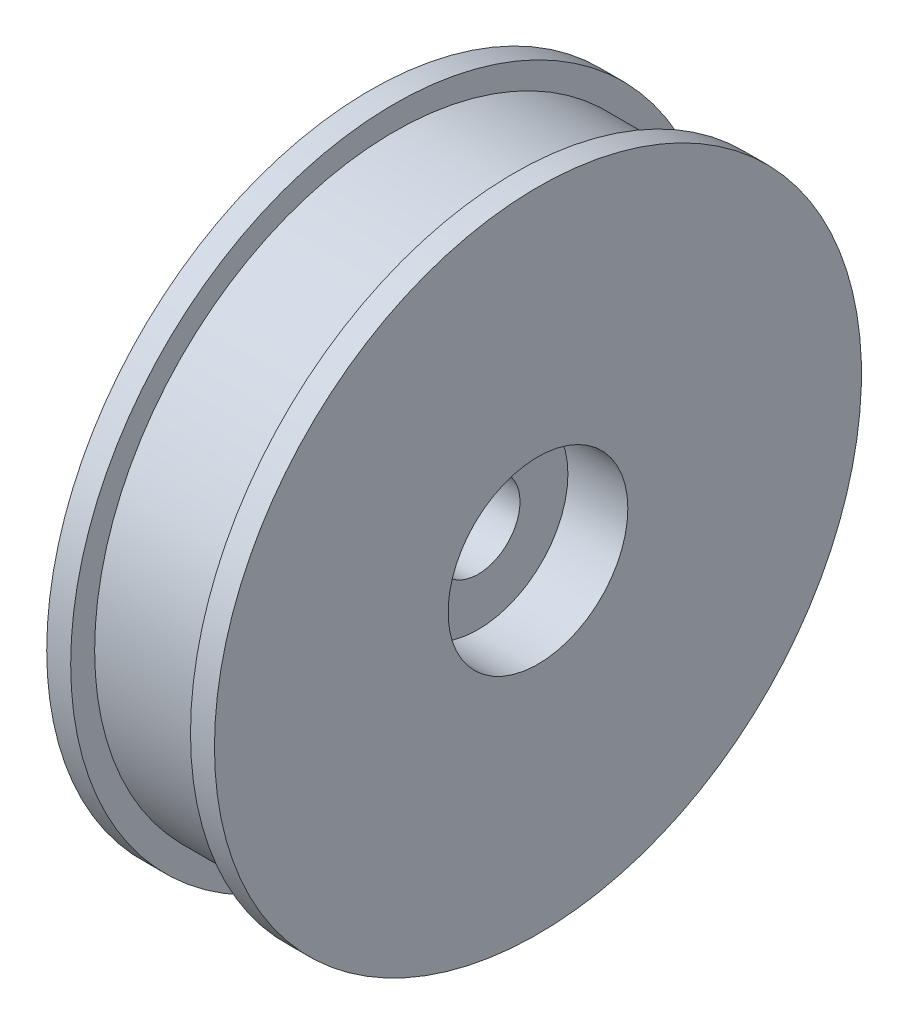
ISO-10303-21;
HEADER;
FILE_DESCRIPTION(('STEP AP214'),'2;1');
FILE_NAME('part.step','',(''),(''),'','','');
FILE_SCHEMA(('AUTOMOTIVE_DESIGN { 1 0 10303 214 1 1 1 1 }'));
ENDSEC;
DATA;
#1=APPLICATION_CONTEXT('core data for automotive mechanical design processes');
#2=APPLICATION_PROTOCOL_DEFINITION('international standard','automotive_design',2000,#1);
#3=PRODUCT_CONTEXT('',#1,'mechanical');
#4=PRODUCT('Part','Part','',(#3));
#5=PRODUCT_RELATED_PRODUCT_CATEGORY('part','',(#4));
#6=PRODUCT_DEFINITION_FORMATION('','',#4);
#7=PRODUCT_DEFINITION_CONTEXT('part definition',#1,'design');
#8=PRODUCT_DEFINITION('design','',#6,#7);
#9=PRODUCT_DEFINITION_SHAPE('','',#8);
#10=(LENGTH_UNIT() NAMED_UNIT(*) SI_UNIT(.MILLI.,.METRE.));
#11=(NAMED_UNIT(*) PLANE_ANGLE_UNIT() SI_UNIT($,.RADIAN.));
#12=(NAMED_UNIT(*) SI_UNIT($,.STERADIAN.) SOLID_ANGLE_UNIT());
#13=UNCERTAINTY_MEASURE_WITH_UNIT(LENGTH_MEASURE(1.E-05),#10,'distance_accuracy_value','');
#14=(GEOMETRIC_REPRESENTATION_CONTEXT(3) GLOBAL_UNCERTAINTY_ASSIGNED_CONTEXT((#13)) GLOBAL_UNIT_ASSIGNED_CONTEXT((#10,
#11,#12)) REPRESENTATION_CONTEXT('',''));
#15=CARTESIAN_POINT('',(0.,0.,0.));
#16=DIRECTION('',(0.,0.,1.));
#17=DIRECTION('',(1.,0.,0.));
#18=AXIS2_PLACEMENT_3D('',#15,#16,#17);
#19=CARTESIAN_POINT('',(-9.5,0.,0.));
#20=DIRECTION('',(1.,0.,0.));
#21=DIRECTION('',(0.,0.,-1.));
#22=AXIS2_PLACEMENT_3D('',#19,#20,#21);
#23=CYLINDRICAL_SURFACE('',#22,3.5);
#24=CARTESIAN_POINT('',(-9.5,0.,0.));
#25=DIRECTION('',(1.,0.,0.));
#26=DIRECTION('',(0.,0.,-1.));
#27=AXIS2_PLACEMENT_3D('',#24,#25,#26);
#28=CIRCLE('',#27,3.5);
#29=CARTESIAN_POINT('',(-9.5,0.,-3.5));
#30=VERTEX_POINT('',#29);
#31=EDGE_CURVE('E66',#30,#30,#28,.T.);
#32=ORIENTED_EDGE('',*,*,#31,.F.);
#33=EDGE_LOOP('',(#32));
#34=FACE_BOUND('',#33,.T.);
#35=CARTESIAN_POINT('',(4.5,0.,0.));
#36=DIRECTION('',(1.,0.,0.));
#37=DIRECTION('',(0.,0.,-1.));
#38=AXIS2_PLACEMENT_3D('',#35,#36,#37);
#39=CIRCLE('',#38,3.5);
#40=CARTESIAN_POINT('',(4.5,0.,-3.5));
#41=VERTEX_POINT('',#40);
#42=EDGE_CURVE('E38',#41,#41,#39,.F.);
#43=ORIENTED_EDGE('',*,*,#42,.F.);
#44=EDGE_LOOP('',(#43));
#45=FACE_BOUND('',#44,.T.);
#46=ADVANCED_FACE('F34',(#34,#45),#23,.F.);
#47=CARTESIAN_POINT('',(9.5,0.,0.));
#48=DIRECTION('',(-1.,0.,0.));
#49=DIRECTION('',(0.,0.,1.));
#50=AXIS2_PLACEMENT_3D('',#47,#48,#49);
#51=PLANE('',#50);
#52=CARTESIAN_POINT('',(9.5,0.,0.));
#53=DIRECTION('',(1.,0.,0.));
#54=DIRECTION('',(0.,0.,-1.));
#55=AXIS2_PLACEMENT_3D('',#52,#53,#54);
#56=CIRCLE('',#55,7.5);
#57=CARTESIAN_POINT('',(9.5,0.,-7.5));
#58=VERTEX_POINT('',#57);
#59=EDGE_CURVE('E69',#58,#58,#56,.T.);
#60=ORIENTED_EDGE('',*,*,#59,.F.);
#61=EDGE_LOOP('',(#60));
#62=FACE_BOUND('',#61,.T.);
#63=CARTESIAN_POINT('',(9.49999999999999,0.,0.));
#64=DIRECTION('',(-1.,0.,0.));
#65=DIRECTION('',(0.,0.,1.));
#66=AXIS2_PLACEMENT_3D('',#63,#64,#65);
#67=CIRCLE('',#66,27.);
#68=CARTESIAN_POINT('',(9.49999999999999,0.,27.));
#69=VERTEX_POINT('',#68);
#70=EDGE_CURVE('E10',#69,#69,#67,.T.);
#71=ORIENTED_EDGE('',*,*,#70,.F.);
#72=EDGE_LOOP('',(#71));
#73=FACE_BOUND('',#72,.T.);
#74=ADVANCED_FACE('F36',(#62,#73),#51,.F.);
#75=CARTESIAN_POINT('',(-9.5,0.,0.));
#76=DIRECTION('',(-1.,0.,0.));
#77=DIRECTION('',(0.,0.,1.));
#78=AXIS2_PLACEMENT_3D('',#75,#76,#77);
#79=CYLINDRICAL_SURFACE('',#78,27.);
#80=CARTESIAN_POINT('',(7.5,0.,0.));
#81=DIRECTION('',(-1.,0.,0.));
#82=DIRECTION('',(0.,0.,1.));
#83=AXIS2_PLACEMENT_3D('',#80,#81,#82);
#84=CIRCLE('',#83,27.);
#85=CARTESIAN_POINT('',(7.5,0.,27.));
#86=VERTEX_POINT('',#85);
#87=EDGE_CURVE('E42',#86,#86,#84,.T.);
#88=ORIENTED_EDGE('',*,*,#87,.F.);
#89=EDGE_LOOP('',(#88));
#90=FACE_BOUND('',#89,.T.);
#91=ORIENTED_EDGE('',*,*,#70,.T.);
#92=EDGE_LOOP('',(#91));
#93=FACE_BOUND('',#92,.T.);
#94=ADVANCED_FACE('F87',(#90,#93),#79,.T.);
#95=CARTESIAN_POINT('',(7.5,27.,0.));
#96=DIRECTION('',(1.,0.,0.));
#97=DIRECTION('',(0.,0.,-1.));
#98=AXIS2_PLACEMENT_3D('',#95,#96,#97);
#99=PLANE('',#98);
#100=CARTESIAN_POINT('',(7.5,0.,0.));
#101=DIRECTION('',(-1.,0.,0.));
#102=DIRECTION('',(0.,0.,1.));
#103=AXIS2_PLACEMENT_3D('',#100,#101,#102);
#104=CIRCLE('',#103,25.);
#105=CARTESIAN_POINT('',(7.5,0.,25.));
#106=VERTEX_POINT('',#105);
#107=EDGE_CURVE('E46',#106,#106,#104,.T.);
#108=ORIENTED_EDGE('',*,*,#107,.F.);
#109=EDGE_LOOP('',(#108));
#110=FACE_BOUND('',#109,.T.);
#111=ORIENTED_EDGE('',*,*,#87,.T.);
#112=EDGE_LOOP('',(#111));
#113=FACE_BOUND('',#112,.T.);
#114=ADVANCED_FACE('F117',(#110,#113),#99,.F.);
#115=CARTESIAN_POINT('',(-9.5,0.,0.));
#116=DIRECTION('',(-1.,0.,0.));
#117=DIRECTION('',(0.,0.,1.));
#118=AXIS2_PLACEMENT_3D('',#115,#116,#117);
#119=CYLINDRICAL_SURFACE('',#118,25.);
#120=CARTESIAN_POINT('',(-2.5,0.,0.));
#121=DIRECTION('',(-1.,0.,0.));
#122=DIRECTION('',(0.,0.,1.));
#123=AXIS2_PLACEMENT_3D('',#120,#121,#122);
#124=CIRCLE('',#123,25.);
#125=CARTESIAN_POINT('',(-2.5,0.,25.));
#126=VERTEX_POINT('',#125);
#127=EDGE_CURVE('E51',#126,#126,#124,.T.);
#128=ORIENTED_EDGE('',*,*,#127,.F.);
#129=EDGE_LOOP('',(#128));
#130=FACE_BOUND('',#129,.T.);
#131=ORIENTED_EDGE('',*,*,#107,.T.);
#132=EDGE_LOOP('',(#131));
#133=FACE_BOUND('',#132,.T.);
#134=ADVANCED_FACE('F113',(#130,#133),#119,.T.);
#135=CARTESIAN_POINT('',(-2.5,25.,0.));
#136=DIRECTION('',(-1.,0.,0.));
#137=DIRECTION('',(0.,0.,1.));
#138=AXIS2_PLACEMENT_3D('',#135,#136,#137);
#139=PLANE('',#138);
#140=CARTESIAN_POINT('',(-2.5,0.,0.));
#141=DIRECTION('',(-1.,0.,0.));
#142=DIRECTION('',(0.,0.,1.));
#143=AXIS2_PLACEMENT_3D('',#140,#141,#142);
#144=CIRCLE('',#143,27.);
#145=CARTESIAN_POINT('',(-2.5,0.,27.));
#146=VERTEX_POINT('',#145);
#147=EDGE_CURVE('E54',#146,#146,#144,.T.);
#148=ORIENTED_EDGE('',*,*,#147,.F.);
#149=EDGE_LOOP('',(#148));
#150=FACE_BOUND('',#149,.T.);
#151=ORIENTED_EDGE('',*,*,#127,.T.);
#152=EDGE_LOOP('',(#151));
#153=FACE_BOUND('',#152,.T.);
#154=ADVANCED_FACE('F109',(#150,#153),#139,.F.);
#155=CARTESIAN_POINT('',(-9.5,0.,0.));
#156=DIRECTION('',(-1.,0.,0.));
#157=DIRECTION('',(0.,0.,1.));
#158=AXIS2_PLACEMENT_3D('',#155,#156,#157);
#159=CYLINDRICAL_SURFACE('',#158,27.);
#160=CARTESIAN_POINT('',(-4.5,0.,0.));
#161=DIRECTION('',(-1.,0.,0.));
#162=DIRECTION('',(0.,0.,1.));
#163=AXIS2_PLACEMENT_3D('',#160,#161,#162);
#164=CIRCLE('',#163,27.);
#165=CARTESIAN_POINT('',(-4.5,0.,27.));
#166=VERTEX_POINT('',#165);
#167=EDGE_CURVE('E57',#166,#166,#164,.T.);
#168=ORIENTED_EDGE('',*,*,#167,.F.);
#169=EDGE_LOOP('',(#168));
#170=FACE_BOUND('',#169,.T.);
#171=ORIENTED_EDGE('',*,*,#147,.T.);
#172=EDGE_LOOP('',(#171));
#173=FACE_BOUND('',#172,.T.);
#174=ADVANCED_FACE('F105',(#170,#173),#159,.T.);
#175=CARTESIAN_POINT('',(-4.5,27.,0.));
#176=DIRECTION('',(1.,0.,0.));
#177=DIRECTION('',(0.,0.,-1.));
#178=AXIS2_PLACEMENT_3D('',#175,#176,#177);
#179=PLANE('',#178);
#180=CARTESIAN_POINT('',(-4.5,0.,0.));
#181=DIRECTION('',(-1.,0.,0.));
#182=DIRECTION('',(0.,0.,1.));
#183=AXIS2_PLACEMENT_3D('',#180,#181,#182);
#184=CIRCLE('',#183,5.);
#185=CARTESIAN_POINT('',(-4.5,0.,5.));
#186=VERTEX_POINT('',#185);
#187=EDGE_CURVE('E60',#186,#186,#184,.T.);
#188=ORIENTED_EDGE('',*,*,#187,.F.);
#189=EDGE_LOOP('',(#188));
#190=FACE_BOUND('',#189,.T.);
#191=ORIENTED_EDGE('',*,*,#167,.T.);
#192=EDGE_LOOP('',(#191));
#193=FACE_BOUND('',#192,.T.);
#194=ADVANCED_FACE('F101',(#190,#193),#179,.F.);
#195=CARTESIAN_POINT('',(-9.5,0.,0.));
#196=DIRECTION('',(-1.,0.,0.));
#197=DIRECTION('',(0.,0.,1.));
#198=AXIS2_PLACEMENT_3D('',#195,#196,#197);
#199=CYLINDRICAL_SURFACE('',#198,5.);
#200=CARTESIAN_POINT('',(-9.5,0.,0.));
#201=DIRECTION('',(-1.,0.,0.));
#202=DIRECTION('',(0.,0.,1.));
#203=AXIS2_PLACEMENT_3D('',#200,#201,#202);
#204=CIRCLE('',#203,5.);
#205=CARTESIAN_POINT('',(-9.5,0.,5.));
#206=VERTEX_POINT('',#205);
#207=EDGE_CURVE('E63',#206,#206,#204,.T.);
#208=ORIENTED_EDGE('',*,*,#207,.F.);
#209=EDGE_LOOP('',(#208));
#210=FACE_BOUND('',#209,.T.);
#211=ORIENTED_EDGE('',*,*,#187,.T.);
#212=EDGE_LOOP('',(#211));
#213=FACE_BOUND('',#212,.T.);
#214=ADVANCED_FACE('F97',(#210,#213),#199,.T.);
#215=CARTESIAN_POINT('',(-9.5,5.,0.));
#216=DIRECTION('',(1.,0.,0.));
#217=DIRECTION('',(0.,0.,-1.));
#218=AXIS2_PLACEMENT_3D('',#215,#216,#217);
#219=PLANE('',#218);
#220=ORIENTED_EDGE('',*,*,#31,.T.);
#221=EDGE_LOOP('',(#220));
#222=FACE_BOUND('',#221,.T.);
#223=ORIENTED_EDGE('',*,*,#207,.T.);
#224=EDGE_LOOP('',(#223));
#225=FACE_BOUND('',#224,.T.);
#226=ADVANCED_FACE('F94',(#222,#225),#219,.F.);
#227=CARTESIAN_POINT('',(4.5,0.,0.));
#228=DIRECTION('',(1.,0.,0.));
#229=DIRECTION('',(0.,0.,-1.));
#230=AXIS2_PLACEMENT_3D('',#227,#228,#229);
#231=PLANE('',#230);
#232=CARTESIAN_POINT('',(4.5,0.,0.));
#233=DIRECTION('',(1.,0.,0.));
#234=DIRECTION('',(0.,0.,-1.));
#235=AXIS2_PLACEMENT_3D('',#232,#233,#234);
#236=CIRCLE('',#235,7.5);
#237=CARTESIAN_POINT('',(4.5,0.,-7.5));
#238=VERTEX_POINT('',#237);
#239=EDGE_CURVE('E72',#238,#238,#236,.T.);
#240=ORIENTED_EDGE('',*,*,#239,.T.);
#241=EDGE_LOOP('',(#240));
#242=FACE_BOUND('',#241,.T.);
#243=ORIENTED_EDGE('',*,*,#42,.T.);
#244=EDGE_LOOP('',(#243));
#245=FACE_BOUND('',#244,.T.);
#246=ADVANCED_FACE('F79',(#242,#245),#231,.T.);
#247=CARTESIAN_POINT('',(4.5,0.,0.));
#248=DIRECTION('',(1.,0.,0.));
#249=DIRECTION('',(0.,0.,-1.));
#250=AXIS2_PLACEMENT_3D('',#247,#248,#249);
#251=CYLINDRICAL_SURFACE('',#250,7.5);
#252=ORIENTED_EDGE('',*,*,#239,.F.);
#253=EDGE_LOOP('',(#252));
#254=FACE_BOUND('',#253,.T.);
#255=ORIENTED_EDGE('',*,*,#59,.T.);
#256=EDGE_LOOP('',(#255));
#257=FACE_BOUND('',#256,.T.);
#258=ADVANCED_FACE('F92',(#254,#257),#251,.F.);
#259=CLOSED_SHELL('',(#46,#74,#94,#114,#134,#154,#174,#194,#214,#226,#246,#258));
#260=MANIFOLD_SOLID_BREP('B2',#259);
#261=ADVANCED_BREP_SHAPE_REPRESENTATION('',(#18,#260),#14);
#262=SHAPE_DEFINITION_REPRESENTATION(#9,#261);
ENDSEC;
END-ISO-10303-21;
